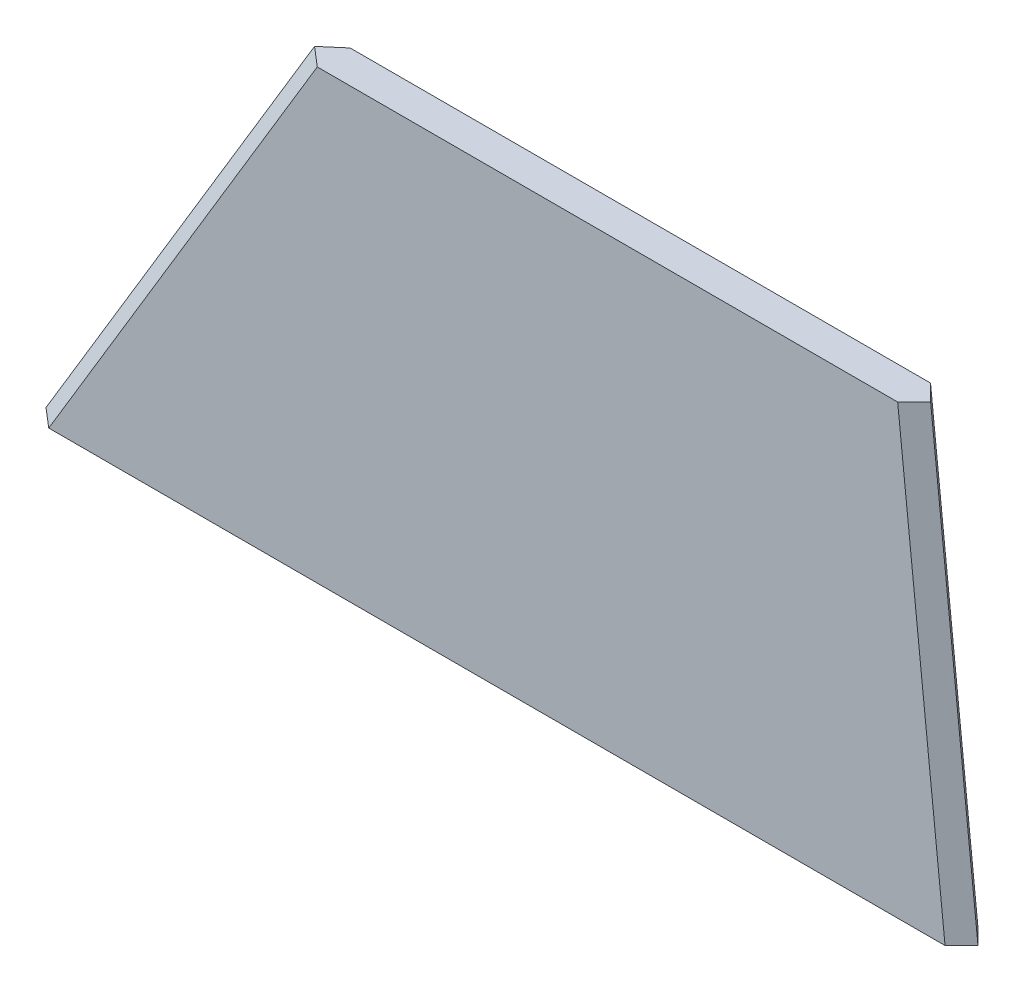
ISO-10303-21;
HEADER;
FILE_DESCRIPTION(('STEP AP214'),'2;1');
FILE_NAME('part.step','',(''),(''),'','','');
FILE_SCHEMA(('AUTOMOTIVE_DESIGN { 1 0 10303 214 1 1 1 1 }'));
ENDSEC;
DATA;
#1=APPLICATION_CONTEXT('core data for automotive mechanical design processes');
#2=APPLICATION_PROTOCOL_DEFINITION('international standard','automotive_design',2000,#1);
#3=PRODUCT_CONTEXT('',#1,'mechanical');
#4=PRODUCT('Part','Part','',(#3));
#5=PRODUCT_RELATED_PRODUCT_CATEGORY('part','',(#4));
#6=PRODUCT_DEFINITION_FORMATION('','',#4);
#7=PRODUCT_DEFINITION_CONTEXT('part definition',#1,'design');
#8=PRODUCT_DEFINITION('design','',#6,#7);
#9=PRODUCT_DEFINITION_SHAPE('','',#8);
#10=(LENGTH_UNIT() NAMED_UNIT(*) SI_UNIT(.MILLI.,.METRE.));
#11=(NAMED_UNIT(*) PLANE_ANGLE_UNIT() SI_UNIT($,.RADIAN.));
#12=(NAMED_UNIT(*) SI_UNIT($,.STERADIAN.) SOLID_ANGLE_UNIT());
#13=UNCERTAINTY_MEASURE_WITH_UNIT(LENGTH_MEASURE(1.E-05),#10,'distance_accuracy_value','');
#14=(GEOMETRIC_REPRESENTATION_CONTEXT(3) GLOBAL_UNCERTAINTY_ASSIGNED_CONTEXT((#13)) GLOBAL_UNIT_ASSIGNED_CONTEXT((#10,
#11,#12)) REPRESENTATION_CONTEXT('',''));
#15=CARTESIAN_POINT('',(0.,0.,0.));
#16=DIRECTION('',(0.,0.,1.));
#17=DIRECTION('',(1.,0.,0.));
#18=AXIS2_PLACEMENT_3D('',#15,#16,#17);
#19=CARTESIAN_POINT('',(0.,0.,5.2832));
#20=DIRECTION('',(0.,1.,0.));
#21=DIRECTION('',(0.,0.,1.));
#22=AXIS2_PLACEMENT_3D('',#19,#20,#21);
#23=PLANE('',#22);
#24=DIRECTION('',(-0.709079457886906,0.,-0.705128585722357));
#25=VECTOR('',#24,1.);
#26=CARTESIAN_POINT('',(152.4,0.,3.80999999999998));
#27=LINE('',#26,#25);
#28=CARTESIAN_POINT('',(148.568652371707,0.,0.));
#29=VERTEX_POINT('',#28);
#30=CARTESIAN_POINT('',(151.22505339399,0.,2.64159999999997));
#31=VERTEX_POINT('',#30);
#32=EDGE_CURVE('E60',#29,#31,#27,.F.);
#33=ORIENTED_EDGE('',*,*,#32,.T.);
#34=DIRECTION('',(-0.709079457886907,0.,0.705128585722356));
#35=VECTOR('',#34,1.);
#36=CARTESIAN_POINT('',(147.738546540156,0.,6.10868062067064));
#37=LINE('',#36,#35);
#38=CARTESIAN_POINT('',(148.568652371707,0.,5.2832));
#39=VERTEX_POINT('',#38);
#40=EDGE_CURVE('E118',#31,#39,#37,.T.);
#41=ORIENTED_EDGE('',*,*,#40,.T.);
#42=DIRECTION('',(1.,0.,0.));
#43=VECTOR('',#42,1.);
#44=CARTESIAN_POINT('',(0.,0.,5.2832));
#45=LINE('',#44,#43);
#46=CARTESIAN_POINT('',(4.44457126430465,0.,5.2832));
#47=VERTEX_POINT('',#46);
#48=EDGE_CURVE('E110',#47,#39,#45,.T.);
#49=ORIENTED_EDGE('',*,*,#48,.F.);
#50=DIRECTION('',(-0.759225583475301,0.,-0.650827560415652));
#51=VECTOR('',#50,1.);
#52=CARTESIAN_POINT('',(3.76523199935365,0.,4.700853032082));
#53=LINE('',#52,#51);
#54=CARTESIAN_POINT('',(1.36300185438676,0.,2.6416));
#55=VERTEX_POINT('',#54);
#56=EDGE_CURVE('E67',#47,#55,#53,.T.);
#57=ORIENTED_EDGE('',*,*,#56,.T.);
#58=DIRECTION('',(-0.759225583475305,0.,0.650827560415647));
#59=VECTOR('',#58,1.);
#60=CARTESIAN_POINT('',(24.8899661515355,0.,-17.526314663004));
#61=LINE('',#60,#59);
#62=CARTESIAN_POINT('',(4.44457126430468,0.,0.));
#63=VERTEX_POINT('',#62);
#64=EDGE_CURVE('E103',#55,#63,#61,.F.);
#65=ORIENTED_EDGE('',*,*,#64,.T.);
#66=DIRECTION('',(1.,0.,0.));
#67=VECTOR('',#66,1.);
#68=CARTESIAN_POINT('',(0.,0.,0.));
#69=LINE('',#68,#67);
#70=EDGE_CURVE('E126',#63,#29,#69,.T.);
#71=ORIENTED_EDGE('',*,*,#70,.T.);
#72=EDGE_LOOP('',(#33,#41,#49,#57,#65,#71));
#73=FACE_BOUND('',#72,.T.);
#74=ADVANCED_FACE('F41',(#73),#23,.F.);
#75=CARTESIAN_POINT('',(144.78,71.882,5.2832));
#76=DIRECTION('',(0.,-1.,0.));
#77=DIRECTION('',(1.,0.,0.));
#78=AXIS2_PLACEMENT_3D('',#75,#76,#77);
#79=PLANE('',#78);
#80=DIRECTION('',(-1.,0.,0.));
#81=VECTOR('',#80,1.);
#82=CARTESIAN_POINT('',(144.78,71.882,5.2832));
#83=LINE('',#82,#81);
#84=CARTESIAN_POINT('',(140.948652371707,71.882,5.2832));
#85=VERTEX_POINT('',#84);
#86=CARTESIAN_POINT('',(47.6245712643046,71.882,5.2832));
#87=VERTEX_POINT('',#86);
#88=EDGE_CURVE('E113',#85,#87,#83,.T.);
#89=ORIENTED_EDGE('',*,*,#88,.F.);
#90=DIRECTION('',(0.709079457886907,0.,-0.705128585722356));
#91=VECTOR('',#90,1.);
#92=CARTESIAN_POINT('',(143.949834363447,71.882,2.2987400924498));
#93=LINE('',#92,#91);
#94=CARTESIAN_POINT('',(143.60505339399,71.882,2.64159999999998));
#95=VERTEX_POINT('',#94);
#96=EDGE_CURVE('E143',#85,#95,#93,.T.);
#97=ORIENTED_EDGE('',*,*,#96,.T.);
#98=DIRECTION('',(0.709079457886906,0.,0.705128585722357));
#99=VECTOR('',#98,1.);
#100=CARTESIAN_POINT('',(148.611287823291,71.882,7.61994052822082));
#101=LINE('',#100,#99);
#102=CARTESIAN_POINT('',(140.948652371707,71.882,0.));
#103=VERTEX_POINT('',#102);
#104=EDGE_CURVE('E140',#95,#103,#101,.F.);
#105=ORIENTED_EDGE('',*,*,#104,.T.);
#106=DIRECTION('',(-1.,0.,0.));
#107=VECTOR('',#106,1.);
#108=CARTESIAN_POINT('',(144.78,71.882,0.));
#109=LINE('',#108,#107);
#110=CARTESIAN_POINT('',(47.6245712643047,71.882,0.));
#111=VERTEX_POINT('',#110);
#112=EDGE_CURVE('E120',#103,#111,#109,.T.);
#113=ORIENTED_EDGE('',*,*,#112,.T.);
#114=DIRECTION('',(0.759225583475305,0.,-0.650827560415647));
#115=VECTOR('',#114,1.);
#116=CARTESIAN_POINT('',(43.18,71.882,3.80999999999999));
#117=LINE('',#116,#115);
#118=CARTESIAN_POINT('',(44.5430018543867,71.882,2.6416));
#119=VERTEX_POINT('',#118);
#120=EDGE_CURVE('E134',#111,#119,#117,.F.);
#121=ORIENTED_EDGE('',*,*,#120,.T.);
#122=DIRECTION('',(0.759225583475301,0.,0.650827560415652));
#123=VECTOR('',#122,1.);
#124=CARTESIAN_POINT('',(22.0552658478183,71.882,-16.635461630922));
#125=LINE('',#124,#123);
#126=EDGE_CURVE('E137',#119,#87,#125,.T.);
#127=ORIENTED_EDGE('',*,*,#126,.T.);
#128=EDGE_LOOP('',(#89,#97,#105,#113,#121,#127));
#129=FACE_BOUND('',#128,.T.);
#130=ADVANCED_FACE('F164',(#129),#79,.F.);
#131=CARTESIAN_POINT('',(0.,0.,5.2832));
#132=DIRECTION('',(0.,0.,1.));
#133=DIRECTION('',(1.,0.,0.));
#134=AXIS2_PLACEMENT_3D('',#131,#132,#133);
#135=PLANE('',#134);
#136=ORIENTED_EDGE('',*,*,#48,.T.);
#137=DIRECTION('',(-0.105416413486598,0.994428167223567,0.));
#138=VECTOR('',#137,1.);
#139=CARTESIAN_POINT('',(140.991228682878,71.4803634646161,5.2832));
#140=LINE('',#139,#138);
#141=EDGE_CURVE('E115',#39,#85,#140,.T.);
#142=ORIENTED_EDGE('',*,*,#141,.T.);
#143=ORIENTED_EDGE('',*,*,#88,.T.);
#144=DIRECTION('',(-0.514941136817021,-0.857225539524806,0.));
#145=VECTOR('',#144,1.);
#146=CARTESIAN_POINT('',(3.26602930558951,-1.96192573127285,5.2832));
#147=LINE('',#146,#145);
#148=EDGE_CURVE('E100',#87,#47,#147,.T.);
#149=ORIENTED_EDGE('',*,*,#148,.T.);
#150=EDGE_LOOP('',(#136,#142,#143,#149));
#151=FACE_BOUND('',#150,.T.);
#152=ADVANCED_FACE('F108',(#151),#135,.T.);
#153=CARTESIAN_POINT('',(0.,0.,0.));
#154=DIRECTION('',(0.,0.,1.));
#155=DIRECTION('',(1.,0.,0.));
#156=AXIS2_PLACEMENT_3D('',#153,#154,#155);
#157=PLANE('',#156);
#158=ORIENTED_EDGE('',*,*,#112,.F.);
#159=DIRECTION('',(0.105416413486598,-0.994428167223567,0.));
#160=VECTOR('',#159,1.);
#161=CARTESIAN_POINT('',(146.917665359464,15.574310815491,0.));
#162=LINE('',#161,#160);
#163=EDGE_CURVE('E11',#103,#29,#162,.T.);
#164=ORIENTED_EDGE('',*,*,#163,.T.);
#165=ORIENTED_EDGE('',*,*,#70,.F.);
#166=DIRECTION('',(0.514941136817021,0.857225539524806,0.));
#167=VECTOR('',#166,1.);
#168=CARTESIAN_POINT('',(3.26602930558953,-1.96192573127286,0.));
#169=LINE('',#168,#167);
#170=EDGE_CURVE('E52',#63,#111,#169,.T.);
#171=ORIENTED_EDGE('',*,*,#170,.T.);
#172=EDGE_LOOP('',(#158,#164,#165,#171));
#173=FACE_BOUND('',#172,.T.);
#174=ADVANCED_FACE('F167',(#173),#157,.F.);
#175=CARTESIAN_POINT('',(152.4,0.,3.80999999999998));
#176=DIRECTION('',(-0.703166900446695,-0.0745406608247384,0.707106781186547));
#177=DIRECTION('',(-0.105416413486598,0.994428167223567,0.));
#178=AXIS2_PLACEMENT_3D('',#175,#176,#177);
#179=PLANE('',#178);
#180=DIRECTION('',(0.105416413486598,-0.994428167223567,0.));
#181=VECTOR('',#180,1.);
#182=CARTESIAN_POINT('',(149.544546806002,15.8527788133572,2.64159999999998));
#183=LINE('',#182,#181);
#184=EDGE_CURVE('E130',#31,#95,#183,.F.);
#185=ORIENTED_EDGE('',*,*,#184,.F.);
#186=ORIENTED_EDGE('',*,*,#32,.F.);
#187=ORIENTED_EDGE('',*,*,#163,.F.);
#188=ORIENTED_EDGE('',*,*,#104,.F.);
#189=EDGE_LOOP('',(#185,#186,#187,#188));
#190=FACE_BOUND('',#189,.T.);
#191=ADVANCED_FACE('F160',(#190),#179,.F.);
#192=CARTESIAN_POINT('',(146.917665359464,15.574310815491,5.2832));
#193=DIRECTION('',(0.703166900446694,0.0745406608247383,0.707106781186548));
#194=DIRECTION('',(0.105416413486598,-0.994428167223567,0.));
#195=AXIS2_PLACEMENT_3D('',#192,#193,#194);
#196=PLANE('',#195);
#197=ORIENTED_EDGE('',*,*,#40,.F.);
#198=ORIENTED_EDGE('',*,*,#184,.T.);
#199=ORIENTED_EDGE('',*,*,#96,.F.);
#200=ORIENTED_EDGE('',*,*,#141,.F.);
#201=EDGE_LOOP('',(#197,#198,#199,#200));
#202=FACE_BOUND('',#201,.T.);
#203=ADVANCED_FACE('F157',(#202),#196,.T.);
#204=CARTESIAN_POINT('',(43.18,71.882,3.80999999999999));
#205=DIRECTION('',(0.606149992004284,-0.364118369755224,0.707106781186551));
#206=DIRECTION('',(-0.514941136817021,-0.857225539524806,0.));
#207=AXIS2_PLACEMENT_3D('',#204,#205,#206);
#208=PLANE('',#207);
#209=DIRECTION('',(0.514941136817021,0.857225539524806,0.));
#210=VECTOR('',#209,1.);
#211=CARTESIAN_POINT('',(1.00158232038079,-0.601657224257009,2.6416));
#212=LINE('',#211,#210);
#213=EDGE_CURVE('E46',#119,#55,#212,.F.);
#214=ORIENTED_EDGE('',*,*,#213,.F.);
#215=ORIENTED_EDGE('',*,*,#120,.F.);
#216=ORIENTED_EDGE('',*,*,#170,.F.);
#217=ORIENTED_EDGE('',*,*,#64,.F.);
#218=EDGE_LOOP('',(#214,#215,#216,#217));
#219=FACE_BOUND('',#218,.T.);
#220=ADVANCED_FACE('F44',(#219),#208,.F.);
#221=CARTESIAN_POINT('',(3.26602930558951,-1.96192573127285,5.2832));
#222=DIRECTION('',(-0.606149992004288,0.364118369755226,0.707106781186547));
#223=DIRECTION('',(0.514941136817021,0.857225539524806,0.));
#224=AXIS2_PLACEMENT_3D('',#221,#222,#223);
#225=PLANE('',#224);
#226=ORIENTED_EDGE('',*,*,#126,.F.);
#227=ORIENTED_EDGE('',*,*,#213,.T.);
#228=ORIENTED_EDGE('',*,*,#56,.F.);
#229=ORIENTED_EDGE('',*,*,#148,.F.);
#230=EDGE_LOOP('',(#226,#227,#228,#229));
#231=FACE_BOUND('',#230,.T.);
#232=ADVANCED_FACE('F99',(#231),#225,.T.);
#233=CLOSED_SHELL('',(#74,#130,#152,#174,#191,#203,#220,#232));
#234=MANIFOLD_SOLID_BREP('B2',#233);
#235=ADVANCED_BREP_SHAPE_REPRESENTATION('',(#18,#234),#14);
#236=SHAPE_DEFINITION_REPRESENTATION(#9,#235);
ENDSEC;
END-ISO-10303-21;
